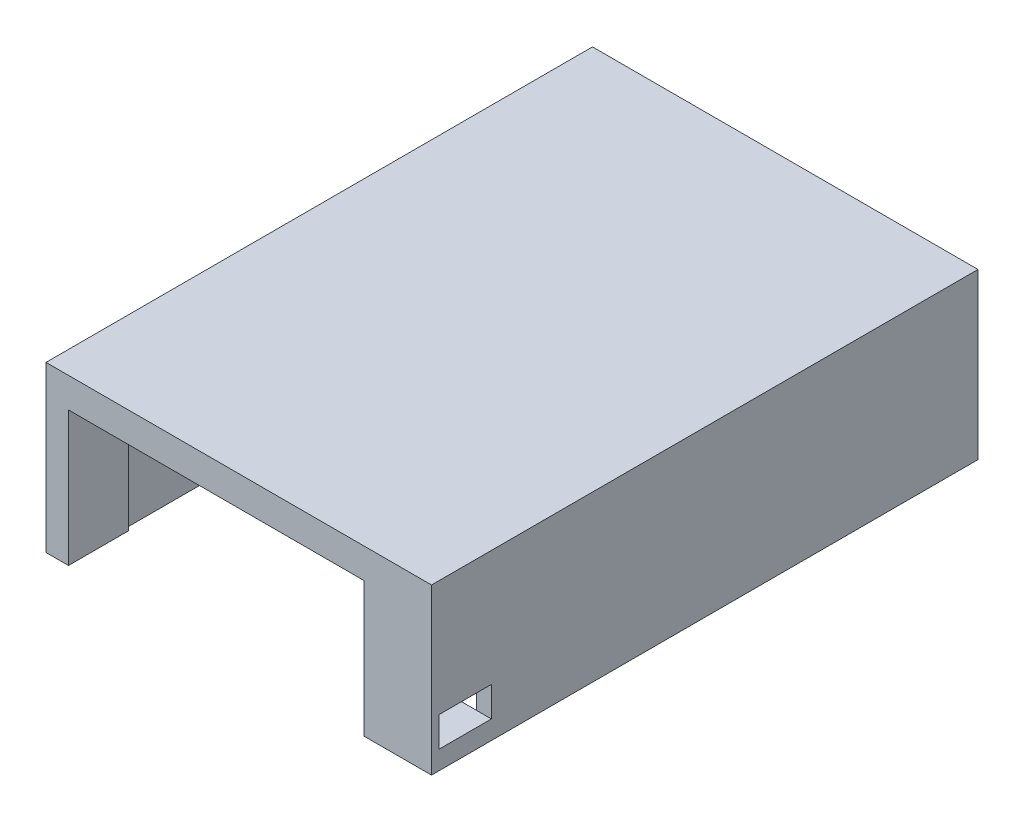
ISO-10303-21;
HEADER;
FILE_DESCRIPTION(('STEP AP214'),'2;1');
FILE_NAME('part.step','',(''),(''),'','','');
FILE_SCHEMA(('AUTOMOTIVE_DESIGN { 1 0 10303 214 1 1 1 1 }'));
ENDSEC;
DATA;
#1=APPLICATION_CONTEXT('core data for automotive mechanical design processes');
#2=APPLICATION_PROTOCOL_DEFINITION('international standard','automotive_design',2000,#1);
#3=PRODUCT_CONTEXT('',#1,'mechanical');
#4=PRODUCT('Part','Part','',(#3));
#5=PRODUCT_RELATED_PRODUCT_CATEGORY('part','',(#4));
#6=PRODUCT_DEFINITION_FORMATION('','',#4);
#7=PRODUCT_DEFINITION_CONTEXT('part definition',#1,'design');
#8=PRODUCT_DEFINITION('design','',#6,#7);
#9=PRODUCT_DEFINITION_SHAPE('','',#8);
#10=(LENGTH_UNIT() NAMED_UNIT(*) SI_UNIT(.MILLI.,.METRE.));
#11=(NAMED_UNIT(*) PLANE_ANGLE_UNIT() SI_UNIT($,.RADIAN.));
#12=(NAMED_UNIT(*) SI_UNIT($,.STERADIAN.) SOLID_ANGLE_UNIT());
#13=UNCERTAINTY_MEASURE_WITH_UNIT(LENGTH_MEASURE(1.E-05),#10,'distance_accuracy_value','');
#14=(GEOMETRIC_REPRESENTATION_CONTEXT(3) GLOBAL_UNCERTAINTY_ASSIGNED_CONTEXT((#13)) GLOBAL_UNIT_ASSIGNED_CONTEXT((#10,
#11,#12)) REPRESENTATION_CONTEXT('',''));
#15=CARTESIAN_POINT('',(0.,0.,0.));
#16=DIRECTION('',(0.,0.,1.));
#17=DIRECTION('',(1.,0.,0.));
#18=AXIS2_PLACEMENT_3D('',#15,#16,#17);
#19=CARTESIAN_POINT('',(-61.3744815271287,22.,35.6818761790594));
#20=DIRECTION('',(0.,0.,-1.));
#21=DIRECTION('',(-1.,0.,0.));
#22=AXIS2_PLACEMENT_3D('',#19,#20,#21);
#23=PLANE('',#22);
#24=DIRECTION('',(0.,-1.,0.));
#25=VECTOR('',#24,1.);
#26=CARTESIAN_POINT('',(-58.3744815271287,18.,35.6818761790594));
#27=LINE('',#26,#25);
#28=CARTESIAN_POINT('',(-58.3744815271287,18.,35.6818761790594));
#29=VERTEX_POINT('',#28);
#30=CARTESIAN_POINT('',(-58.3744815271287,0.,35.6818761790594));
#31=VERTEX_POINT('',#30);
#32=EDGE_CURVE('E355',#29,#31,#27,.T.);
#33=ORIENTED_EDGE('',*,*,#32,.F.);
#34=DIRECTION('',(-1.,0.,0.));
#35=VECTOR('',#34,1.);
#36=CARTESIAN_POINT('',(0.,18.,35.6818761790594));
#37=LINE('',#36,#35);
#38=CARTESIAN_POINT('',(-18.8744815271287,18.,35.6818761790594));
#39=VERTEX_POINT('',#38);
#40=EDGE_CURVE('E323',#39,#29,#37,.T.);
#41=ORIENTED_EDGE('',*,*,#40,.F.);
#42=DIRECTION('',(0.,-1.,0.));
#43=VECTOR('',#42,1.);
#44=CARTESIAN_POINT('',(-18.8744815271287,18.,35.6818761790594));
#45=LINE('',#44,#43);
#46=CARTESIAN_POINT('',(-18.8744815271287,0.,35.6818761790594));
#47=VERTEX_POINT('',#46);
#48=EDGE_CURVE('E358',#39,#47,#45,.T.);
#49=ORIENTED_EDGE('',*,*,#48,.T.);
#50=DIRECTION('',(1.,0.,0.));
#51=VECTOR('',#50,1.);
#52=CARTESIAN_POINT('',(-61.3744815271287,0.,35.6818761790594));
#53=LINE('',#52,#51);
#54=CARTESIAN_POINT('',(-9.87448152712869,0.,35.6818761790594));
#55=VERTEX_POINT('',#54);
#56=EDGE_CURVE('E403',#47,#55,#53,.T.);
#57=ORIENTED_EDGE('',*,*,#56,.T.);
#58=DIRECTION('',(0.,-1.,0.));
#59=VECTOR('',#58,1.);
#60=CARTESIAN_POINT('',(-9.87448152712869,22.,35.6818761790594));
#61=LINE('',#60,#59);
#62=CARTESIAN_POINT('',(-9.87448152712869,22.,35.6818761790594));
#63=VERTEX_POINT('',#62);
#64=EDGE_CURVE('E42',#63,#55,#61,.T.);
#65=ORIENTED_EDGE('',*,*,#64,.F.);
#66=DIRECTION('',(1.,0.,0.));
#67=VECTOR('',#66,1.);
#68=CARTESIAN_POINT('',(-61.3744815271287,22.,35.6818761790594));
#69=LINE('',#68,#67);
#70=CARTESIAN_POINT('',(-61.3744815271287,22.,35.6818761790594));
#71=VERTEX_POINT('',#70);
#72=EDGE_CURVE('E391',#71,#63,#69,.T.);
#73=ORIENTED_EDGE('',*,*,#72,.F.);
#74=DIRECTION('',(0.,-1.,0.));
#75=VECTOR('',#74,1.);
#76=CARTESIAN_POINT('',(-61.3744815271287,22.,35.6818761790594));
#77=LINE('',#76,#75);
#78=CARTESIAN_POINT('',(-61.3744815271287,0.,35.6818761790594));
#79=VERTEX_POINT('',#78);
#80=EDGE_CURVE('E11',#71,#79,#77,.T.);
#81=ORIENTED_EDGE('',*,*,#80,.T.);
#82=EDGE_CURVE('E404',#79,#31,#53,.T.);
#83=ORIENTED_EDGE('',*,*,#82,.T.);
#84=EDGE_LOOP('',(#33,#41,#49,#57,#65,#73,#81,#83));
#85=FACE_BOUND('',#84,.T.);
#86=ADVANCED_FACE('F33',(#85),#23,.F.);
#87=CARTESIAN_POINT('',(-61.3744815271287,22.,-37.3181238209406));
#88=DIRECTION('',(0.,0.,-1.));
#89=DIRECTION('',(-1.,0.,0.));
#90=AXIS2_PLACEMENT_3D('',#87,#88,#89);
#91=PLANE('',#90);
#92=DIRECTION('',(1.,0.,0.));
#93=VECTOR('',#92,1.);
#94=CARTESIAN_POINT('',(-61.3744815271287,0.,-37.3181238209406));
#95=LINE('',#94,#93);
#96=CARTESIAN_POINT('',(-12.8744815271287,0.,-37.3181238209406));
#97=VERTEX_POINT('',#96);
#98=CARTESIAN_POINT('',(-9.8744815271287,0.,-37.3181238209406));
#99=VERTEX_POINT('',#98);
#100=EDGE_CURVE('E410',#97,#99,#95,.T.);
#101=ORIENTED_EDGE('',*,*,#100,.F.);
#102=DIRECTION('',(0.,-1.,0.));
#103=VECTOR('',#102,1.);
#104=CARTESIAN_POINT('',(-12.8744815271287,18.,-37.3181238209406));
#105=LINE('',#104,#103);
#106=CARTESIAN_POINT('',(-12.8744815271287,18.,-37.3181238209406));
#107=VERTEX_POINT('',#106);
#108=EDGE_CURVE('E372',#107,#97,#105,.T.);
#109=ORIENTED_EDGE('',*,*,#108,.F.);
#110=DIRECTION('',(1.,0.,0.));
#111=VECTOR('',#110,1.);
#112=CARTESIAN_POINT('',(0.,18.,-37.3181238209406));
#113=LINE('',#112,#111);
#114=CARTESIAN_POINT('',(-52.3744815271287,18.,-37.3181238209406));
#115=VERTEX_POINT('',#114);
#116=EDGE_CURVE('E310',#115,#107,#113,.T.);
#117=ORIENTED_EDGE('',*,*,#116,.F.);
#118=DIRECTION('',(0.,-1.,0.));
#119=VECTOR('',#118,1.);
#120=CARTESIAN_POINT('',(-52.3744815271287,18.,-37.3181238209406));
#121=LINE('',#120,#119);
#122=CARTESIAN_POINT('',(-52.3744815271287,0.,-37.3181238209406));
#123=VERTEX_POINT('',#122);
#124=EDGE_CURVE('E374',#115,#123,#121,.T.);
#125=ORIENTED_EDGE('',*,*,#124,.T.);
#126=CARTESIAN_POINT('',(-61.3744815271287,0.,-37.3181238209406));
#127=VERTEX_POINT('',#126);
#128=EDGE_CURVE('E392',#127,#123,#95,.T.);
#129=ORIENTED_EDGE('',*,*,#128,.F.);
#130=DIRECTION('',(0.,-1.,0.));
#131=VECTOR('',#130,1.);
#132=CARTESIAN_POINT('',(-61.3744815271287,22.,-37.3181238209406));
#133=LINE('',#132,#131);
#134=CARTESIAN_POINT('',(-61.3744815271287,22.,-37.3181238209406));
#135=VERTEX_POINT('',#134);
#136=EDGE_CURVE('E400',#135,#127,#133,.T.);
#137=ORIENTED_EDGE('',*,*,#136,.F.);
#138=DIRECTION('',(1.,0.,0.));
#139=VECTOR('',#138,1.);
#140=CARTESIAN_POINT('',(-61.3744815271287,22.,-37.3181238209406));
#141=LINE('',#140,#139);
#142=CARTESIAN_POINT('',(-9.8744815271287,22.,-37.3181238209406));
#143=VERTEX_POINT('',#142);
#144=EDGE_CURVE('E397',#135,#143,#141,.T.);
#145=ORIENTED_EDGE('',*,*,#144,.T.);
#146=DIRECTION('',(0.,-1.,0.));
#147=VECTOR('',#146,1.);
#148=CARTESIAN_POINT('',(-9.8744815271287,22.,-37.3181238209406));
#149=LINE('',#148,#147);
#150=EDGE_CURVE('E414',#143,#99,#149,.T.);
#151=ORIENTED_EDGE('',*,*,#150,.T.);
#152=EDGE_LOOP('',(#101,#109,#117,#125,#129,#137,#145,#151));
#153=FACE_BOUND('',#152,.T.);
#154=ADVANCED_FACE('F447',(#153),#91,.T.);
#155=CARTESIAN_POINT('',(0.,0.,0.));
#156=DIRECTION('',(0.,1.,0.));
#157=DIRECTION('',(0.,0.,1.));
#158=AXIS2_PLACEMENT_3D('',#155,#156,#157);
#159=PLANE('',#158);
#160=CARTESIAN_POINT('',(-15.8744815271287,0.,31.6818761790594));
#161=DIRECTION('',(0.,-1.,0.));
#162=DIRECTION('',(0.,0.,-1.));
#163=AXIS2_PLACEMENT_3D('',#160,#161,#162);
#164=CIRCLE('',#163,2.);
#165=CARTESIAN_POINT('',(-15.8744815271287,0.,29.6818761790594));
#166=VERTEX_POINT('',#165);
#167=EDGE_CURVE('E288',#166,#166,#164,.T.);
#168=ORIENTED_EDGE('',*,*,#167,.F.);
#169=EDGE_LOOP('',(#168));
#170=FACE_BOUND('',#169,.T.);
#171=DIRECTION('',(0.,0.,-1.));
#172=VECTOR('',#171,1.);
#173=CARTESIAN_POINT('',(-18.8744815271287,0.,0.));
#174=LINE('',#173,#172);
#175=CARTESIAN_POINT('',(-18.8744815271287,0.,27.6818761790594));
#176=VERTEX_POINT('',#175);
#177=EDGE_CURVE('E302',#47,#176,#174,.T.);
#178=ORIENTED_EDGE('',*,*,#177,.T.);
#179=DIRECTION('',(1.,0.,0.));
#180=VECTOR('',#179,1.);
#181=CARTESIAN_POINT('',(0.,0.,27.6818761790594));
#182=LINE('',#181,#180);
#183=CARTESIAN_POINT('',(-11.8758749410098,0.,27.6818761790594));
#184=VERTEX_POINT('',#183);
#185=EDGE_CURVE('E350',#176,#184,#182,.T.);
#186=ORIENTED_EDGE('',*,*,#185,.T.);
#187=DIRECTION('',(0.,0.,-1.));
#188=VECTOR('',#187,1.);
#189=CARTESIAN_POINT('',(-11.8758749410098,0.,0.));
#190=LINE('',#189,#188);
#191=CARTESIAN_POINT('',(-11.8758749410098,0.,-29.3181238209406));
#192=VERTEX_POINT('',#191);
#193=EDGE_CURVE('E347',#184,#192,#190,.T.);
#194=ORIENTED_EDGE('',*,*,#193,.T.);
#195=DIRECTION('',(-1.,0.,0.));
#196=VECTOR('',#195,1.);
#197=CARTESIAN_POINT('',(0.,0.,-29.3181238209406));
#198=LINE('',#197,#196);
#199=CARTESIAN_POINT('',(-12.8744815271287,0.,-29.3181238209406));
#200=VERTEX_POINT('',#199);
#201=EDGE_CURVE('E344',#192,#200,#198,.T.);
#202=ORIENTED_EDGE('',*,*,#201,.T.);
#203=DIRECTION('',(0.,0.,-1.));
#204=VECTOR('',#203,1.);
#205=CARTESIAN_POINT('',(-12.8744815271287,0.,0.));
#206=LINE('',#205,#204);
#207=EDGE_CURVE('E341',#200,#97,#206,.T.);
#208=ORIENTED_EDGE('',*,*,#207,.T.);
#209=ORIENTED_EDGE('',*,*,#100,.T.);
#210=DIRECTION('',(0.,0.,1.));
#211=VECTOR('',#210,1.);
#212=CARTESIAN_POINT('',(-9.8744815271287,0.,-37.3181238209406));
#213=LINE('',#212,#211);
#214=EDGE_CURVE('E407',#99,#55,#213,.T.);
#215=ORIENTED_EDGE('',*,*,#214,.T.);
#216=ORIENTED_EDGE('',*,*,#56,.F.);
#217=EDGE_LOOP('',(#178,#186,#194,#202,#208,#209,#215,#216));
#218=FACE_BOUND('',#217,.T.);
#219=ADVANCED_FACE('F452',(#170,#218),#159,.F.);
#220=CARTESIAN_POINT('',(-55.3744815271287,0.,-33.3181238209406));
#221=DIRECTION('',(0.,-1.,0.));
#222=DIRECTION('',(0.,0.,-1.));
#223=AXIS2_PLACEMENT_3D('',#220,#221,#222);
#224=CIRCLE('',#223,2.);
#225=CARTESIAN_POINT('',(-55.3744815271287,0.,-35.3181238209406));
#226=VERTEX_POINT('',#225);
#227=EDGE_CURVE('E289',#226,#226,#224,.T.);
#228=ORIENTED_EDGE('',*,*,#227,.F.);
#229=EDGE_LOOP('',(#228));
#230=FACE_BOUND('',#229,.T.);
#231=DIRECTION('',(0.,0.,1.));
#232=VECTOR('',#231,1.);
#233=CARTESIAN_POINT('',(-58.3744815271287,0.,0.));
#234=LINE('',#233,#232);
#235=CARTESIAN_POINT('',(-58.3744815271287,0.,27.6818761790594));
#236=VERTEX_POINT('',#235);
#237=EDGE_CURVE('E296',#236,#31,#234,.T.);
#238=ORIENTED_EDGE('',*,*,#237,.T.);
#239=ORIENTED_EDGE('',*,*,#82,.F.);
#240=DIRECTION('',(0.,0.,1.));
#241=VECTOR('',#240,1.);
#242=CARTESIAN_POINT('',(-61.3744815271287,0.,-37.3181238209406));
#243=LINE('',#242,#241);
#244=EDGE_CURVE('E357',#127,#79,#243,.T.);
#245=ORIENTED_EDGE('',*,*,#244,.F.);
#246=ORIENTED_EDGE('',*,*,#128,.T.);
#247=DIRECTION('',(0.,0.,1.));
#248=VECTOR('',#247,1.);
#249=CARTESIAN_POINT('',(-52.3744815271287,0.,0.));
#250=LINE('',#249,#248);
#251=CARTESIAN_POINT('',(-52.3744815271287,0.,-29.3181238209406));
#252=VERTEX_POINT('',#251);
#253=EDGE_CURVE('E338',#123,#252,#250,.T.);
#254=ORIENTED_EDGE('',*,*,#253,.T.);
#255=DIRECTION('',(-1.,0.,0.));
#256=VECTOR('',#255,1.);
#257=CARTESIAN_POINT('',(0.,0.,-29.3181238209406));
#258=LINE('',#257,#256);
#259=CARTESIAN_POINT('',(-58.8744815271287,0.,-29.3181238209406));
#260=VERTEX_POINT('',#259);
#261=EDGE_CURVE('E335',#252,#260,#258,.T.);
#262=ORIENTED_EDGE('',*,*,#261,.T.);
#263=DIRECTION('',(0.,0.,1.));
#264=VECTOR('',#263,1.);
#265=CARTESIAN_POINT('',(-58.8744815271287,0.,0.));
#266=LINE('',#265,#264);
#267=CARTESIAN_POINT('',(-58.8744815271287,0.,27.6818761790594));
#268=VERTEX_POINT('',#267);
#269=EDGE_CURVE('E332',#260,#268,#266,.T.);
#270=ORIENTED_EDGE('',*,*,#269,.T.);
#271=DIRECTION('',(1.,0.,0.));
#272=VECTOR('',#271,1.);
#273=CARTESIAN_POINT('',(0.,0.,27.6818761790594));
#274=LINE('',#273,#272);
#275=EDGE_CURVE('E329',#268,#236,#274,.T.);
#276=ORIENTED_EDGE('',*,*,#275,.T.);
#277=EDGE_LOOP('',(#238,#239,#245,#246,#254,#262,#270,#276));
#278=FACE_BOUND('',#277,.T.);
#279=ADVANCED_FACE('F464',(#230,#278),#159,.F.);
#280=CARTESIAN_POINT('',(-61.3744815271287,22.,-37.3181238209406));
#281=DIRECTION('',(1.,0.,0.));
#282=DIRECTION('',(0.,0.,-1.));
#283=AXIS2_PLACEMENT_3D('',#280,#281,#282);
#284=PLANE('',#283);
#285=DIRECTION('',(0.,0.,1.));
#286=VECTOR('',#285,1.);
#287=CARTESIAN_POINT('',(-61.3744815271287,2.5,-36.3181238209406));
#288=LINE('',#287,#286);
#289=CARTESIAN_POINT('',(-61.3744815271287,2.5,-36.3181238209406));
#290=VERTEX_POINT('',#289);
#291=CARTESIAN_POINT('',(-61.3744815271287,2.5,-29.3181238209406));
#292=VERTEX_POINT('',#291);
#293=EDGE_CURVE('E265',#290,#292,#288,.T.);
#294=ORIENTED_EDGE('',*,*,#293,.F.);
#295=DIRECTION('',(0.,-1.,0.));
#296=VECTOR('',#295,1.);
#297=CARTESIAN_POINT('',(-61.3744815271287,6.5,-36.3181238209406));
#298=LINE('',#297,#296);
#299=CARTESIAN_POINT('',(-61.3744815271287,6.5,-36.3181238209406));
#300=VERTEX_POINT('',#299);
#301=EDGE_CURVE('E263',#300,#290,#298,.T.);
#302=ORIENTED_EDGE('',*,*,#301,.F.);
#303=DIRECTION('',(0.,0.,-1.));
#304=VECTOR('',#303,1.);
#305=CARTESIAN_POINT('',(-61.3744815271287,6.5,-36.3181238209406));
#306=LINE('',#305,#304);
#307=CARTESIAN_POINT('',(-61.3744815271287,6.5,-29.3181238209406));
#308=VERTEX_POINT('',#307);
#309=EDGE_CURVE('E254',#308,#300,#306,.T.);
#310=ORIENTED_EDGE('',*,*,#309,.F.);
#311=DIRECTION('',(0.,1.,0.));
#312=VECTOR('',#311,1.);
#313=CARTESIAN_POINT('',(-61.3744815271287,6.5,-29.3181238209406));
#314=LINE('',#313,#312);
#315=EDGE_CURVE('E268',#292,#308,#314,.T.);
#316=ORIENTED_EDGE('',*,*,#315,.F.);
#317=EDGE_LOOP('',(#294,#302,#310,#316));
#318=FACE_BOUND('',#317,.T.);
#319=ORIENTED_EDGE('',*,*,#244,.T.);
#320=ORIENTED_EDGE('',*,*,#80,.F.);
#321=DIRECTION('',(0.,0.,1.));
#322=VECTOR('',#321,1.);
#323=CARTESIAN_POINT('',(-61.3744815271287,22.,-37.3181238209406));
#324=LINE('',#323,#322);
#325=EDGE_CURVE('E388',#135,#71,#324,.T.);
#326=ORIENTED_EDGE('',*,*,#325,.F.);
#327=ORIENTED_EDGE('',*,*,#136,.T.);
#328=EDGE_LOOP('',(#319,#320,#326,#327));
#329=FACE_BOUND('',#328,.T.);
#330=ADVANCED_FACE('F35',(#318,#329),#284,.F.);
#331=CARTESIAN_POINT('',(-9.8744815271287,22.,-37.3181238209406));
#332=DIRECTION('',(1.,0.,0.));
#333=DIRECTION('',(0.,0.,-1.));
#334=AXIS2_PLACEMENT_3D('',#331,#332,#333);
#335=PLANE('',#334);
#336=DIRECTION('',(0.,-1.,0.));
#337=VECTOR('',#336,1.);
#338=CARTESIAN_POINT('',(-9.87448152712869,6.5,34.6818761790594));
#339=LINE('',#338,#337);
#340=CARTESIAN_POINT('',(-9.87448152712869,6.5,34.6818761790594));
#341=VERTEX_POINT('',#340);
#342=CARTESIAN_POINT('',(-9.87448152712869,2.5,34.6818761790594));
#343=VERTEX_POINT('',#342);
#344=EDGE_CURVE('E50',#341,#343,#339,.T.);
#345=ORIENTED_EDGE('',*,*,#344,.F.);
#346=DIRECTION('',(0.,0.,1.));
#347=VECTOR('',#346,1.);
#348=CARTESIAN_POINT('',(-9.87448152712869,6.5,34.6818761790594));
#349=LINE('',#348,#347);
#350=CARTESIAN_POINT('',(-9.87448152712869,6.5,27.6818761790594));
#351=VERTEX_POINT('',#350);
#352=EDGE_CURVE('E231',#351,#341,#349,.T.);
#353=ORIENTED_EDGE('',*,*,#352,.F.);
#354=DIRECTION('',(0.,1.,0.));
#355=VECTOR('',#354,1.);
#356=CARTESIAN_POINT('',(-9.87448152712869,6.5,27.6818761790594));
#357=LINE('',#356,#355);
#358=CARTESIAN_POINT('',(-9.87448152712869,2.5,27.6818761790594));
#359=VERTEX_POINT('',#358);
#360=EDGE_CURVE('E234',#359,#351,#357,.T.);
#361=ORIENTED_EDGE('',*,*,#360,.F.);
#362=DIRECTION('',(0.,0.,-1.));
#363=VECTOR('',#362,1.);
#364=CARTESIAN_POINT('',(-9.87448152712869,2.5,34.6818761790594));
#365=LINE('',#364,#363);
#366=EDGE_CURVE('E240',#343,#359,#365,.T.);
#367=ORIENTED_EDGE('',*,*,#366,.F.);
#368=EDGE_LOOP('',(#345,#353,#361,#367));
#369=FACE_BOUND('',#368,.T.);
#370=ORIENTED_EDGE('',*,*,#214,.F.);
#371=ORIENTED_EDGE('',*,*,#150,.F.);
#372=DIRECTION('',(0.,0.,1.));
#373=VECTOR('',#372,1.);
#374=CARTESIAN_POINT('',(-9.8744815271287,22.,-37.3181238209406));
#375=LINE('',#374,#373);
#376=EDGE_CURVE('E394',#143,#63,#375,.T.);
#377=ORIENTED_EDGE('',*,*,#376,.T.);
#378=ORIENTED_EDGE('',*,*,#64,.T.);
#379=EDGE_LOOP('',(#370,#371,#377,#378));
#380=FACE_BOUND('',#379,.T.);
#381=ADVANCED_FACE('F457',(#369,#380),#335,.T.);
#382=CARTESIAN_POINT('',(0.,22.,0.));
#383=DIRECTION('',(0.,1.,0.));
#384=DIRECTION('',(0.,0.,1.));
#385=AXIS2_PLACEMENT_3D('',#382,#383,#384);
#386=PLANE('',#385);
#387=ORIENTED_EDGE('',*,*,#325,.T.);
#388=ORIENTED_EDGE('',*,*,#72,.T.);
#389=ORIENTED_EDGE('',*,*,#376,.F.);
#390=ORIENTED_EDGE('',*,*,#144,.F.);
#391=EDGE_LOOP('',(#387,#388,#389,#390));
#392=FACE_BOUND('',#391,.T.);
#393=ADVANCED_FACE('F459',(#392),#386,.T.);
#394=CARTESIAN_POINT('',(-58.3744815271287,18.,0.));
#395=DIRECTION('',(1.,0.,0.));
#396=DIRECTION('',(0.,0.,-1.));
#397=AXIS2_PLACEMENT_3D('',#394,#395,#396);
#398=PLANE('',#397);
#399=ORIENTED_EDGE('',*,*,#237,.F.);
#400=DIRECTION('',(0.,-1.,0.));
#401=VECTOR('',#400,1.);
#402=CARTESIAN_POINT('',(-58.3744815271287,18.,27.6818761790594));
#403=LINE('',#402,#401);
#404=CARTESIAN_POINT('',(-58.3744815271287,18.,27.6818761790594));
#405=VERTEX_POINT('',#404);
#406=EDGE_CURVE('E326',#405,#236,#403,.T.);
#407=ORIENTED_EDGE('',*,*,#406,.F.);
#408=DIRECTION('',(0.,0.,1.));
#409=VECTOR('',#408,1.);
#410=CARTESIAN_POINT('',(-58.3744815271287,18.,0.));
#411=LINE('',#410,#409);
#412=EDGE_CURVE('E299',#405,#29,#411,.T.);
#413=ORIENTED_EDGE('',*,*,#412,.T.);
#414=ORIENTED_EDGE('',*,*,#32,.T.);
#415=EDGE_LOOP('',(#399,#407,#413,#414));
#416=FACE_BOUND('',#415,.T.);
#417=ADVANCED_FACE('F468',(#416),#398,.T.);
#418=CARTESIAN_POINT('',(-18.8744815271287,18.,0.));
#419=DIRECTION('',(-1.,0.,0.));
#420=DIRECTION('',(0.,0.,1.));
#421=AXIS2_PLACEMENT_3D('',#418,#419,#420);
#422=PLANE('',#421);
#423=ORIENTED_EDGE('',*,*,#177,.F.);
#424=ORIENTED_EDGE('',*,*,#48,.F.);
#425=DIRECTION('',(0.,0.,-1.));
#426=VECTOR('',#425,1.);
#427=CARTESIAN_POINT('',(-18.8744815271287,18.,0.));
#428=LINE('',#427,#426);
#429=CARTESIAN_POINT('',(-18.8744815271287,18.,27.6818761790594));
#430=VERTEX_POINT('',#429);
#431=EDGE_CURVE('E321',#39,#430,#428,.T.);
#432=ORIENTED_EDGE('',*,*,#431,.T.);
#433=DIRECTION('',(0.,-1.,0.));
#434=VECTOR('',#433,1.);
#435=CARTESIAN_POINT('',(-18.8744815271287,18.,27.6818761790594));
#436=LINE('',#435,#434);
#437=EDGE_CURVE('E361',#430,#176,#436,.T.);
#438=ORIENTED_EDGE('',*,*,#437,.T.);
#439=EDGE_LOOP('',(#423,#424,#432,#438));
#440=FACE_BOUND('',#439,.T.);
#441=ADVANCED_FACE('F472',(#440),#422,.T.);
#442=CARTESIAN_POINT('',(0.,18.,27.6818761790594));
#443=DIRECTION('',(0.,0.,-1.));
#444=DIRECTION('',(-1.,0.,0.));
#445=AXIS2_PLACEMENT_3D('',#442,#443,#444);
#446=PLANE('',#445);
#447=DIRECTION('',(1.,0.,0.));
#448=VECTOR('',#447,1.);
#449=CARTESIAN_POINT('',(-18.3744815271287,6.5,27.6818761790594));
#450=LINE('',#449,#448);
#451=CARTESIAN_POINT('',(-18.3744815271287,6.5,27.6818761790594));
#452=VERTEX_POINT('',#451);
#453=CARTESIAN_POINT('',(-11.8758749410098,6.5,27.6818761790594));
#454=VERTEX_POINT('',#453);
#455=EDGE_CURVE('E58',#452,#454,#450,.T.);
#456=ORIENTED_EDGE('',*,*,#455,.F.);
#457=DIRECTION('',(0.,1.,0.));
#458=VECTOR('',#457,1.);
#459=CARTESIAN_POINT('',(-18.3744815271287,6.5,27.6818761790594));
#460=LINE('',#459,#458);
#461=CARTESIAN_POINT('',(-18.3744815271287,2.5,27.6818761790594));
#462=VERTEX_POINT('',#461);
#463=EDGE_CURVE('E228',#462,#452,#460,.T.);
#464=ORIENTED_EDGE('',*,*,#463,.F.);
#465=DIRECTION('',(1.,0.,0.));
#466=VECTOR('',#465,1.);
#467=CARTESIAN_POINT('',(-18.3744815271287,2.5,27.6818761790594));
#468=LINE('',#467,#466);
#469=CARTESIAN_POINT('',(-11.8758749410098,2.5,27.6818761790594));
#470=VERTEX_POINT('',#469);
#471=EDGE_CURVE('E225',#462,#470,#468,.T.);
#472=ORIENTED_EDGE('',*,*,#471,.T.);
#473=DIRECTION('',(0.,-1.,0.));
#474=VECTOR('',#473,1.);
#475=CARTESIAN_POINT('',(-11.8758749410098,18.,27.6818761790594));
#476=LINE('',#475,#474);
#477=EDGE_CURVE('E367',#470,#184,#476,.T.);
#478=ORIENTED_EDGE('',*,*,#477,.T.);
#479=ORIENTED_EDGE('',*,*,#185,.F.);
#480=ORIENTED_EDGE('',*,*,#437,.F.);
#481=DIRECTION('',(1.,0.,0.));
#482=VECTOR('',#481,1.);
#483=CARTESIAN_POINT('',(0.,18.,27.6818761790594));
#484=LINE('',#483,#482);
#485=CARTESIAN_POINT('',(-11.8758749410098,18.,27.6818761790594));
#486=VERTEX_POINT('',#485);
#487=EDGE_CURVE('E319',#430,#486,#484,.T.);
#488=ORIENTED_EDGE('',*,*,#487,.T.);
#489=EDGE_CURVE('E363',#486,#454,#476,.T.);
#490=ORIENTED_EDGE('',*,*,#489,.T.);
#491=EDGE_LOOP('',(#456,#464,#472,#478,#479,#480,#488,#490));
#492=FACE_BOUND('',#491,.T.);
#493=ADVANCED_FACE('F502',(#492),#446,.T.);
#494=CARTESIAN_POINT('',(-11.8758749410098,18.,0.));
#495=DIRECTION('',(-1.,0.,0.));
#496=DIRECTION('',(0.,0.,1.));
#497=AXIS2_PLACEMENT_3D('',#494,#495,#496);
#498=PLANE('',#497);
#499=ORIENTED_EDGE('',*,*,#193,.F.);
#500=ORIENTED_EDGE('',*,*,#477,.F.);
#501=EDGE_CURVE('E366',#454,#470,#476,.T.);
#502=ORIENTED_EDGE('',*,*,#501,.F.);
#503=ORIENTED_EDGE('',*,*,#489,.F.);
#504=DIRECTION('',(0.,0.,-1.));
#505=VECTOR('',#504,1.);
#506=CARTESIAN_POINT('',(-11.8758749410098,18.,0.));
#507=LINE('',#506,#505);
#508=CARTESIAN_POINT('',(-11.8758749410098,18.,-29.3181238209406));
#509=VERTEX_POINT('',#508);
#510=EDGE_CURVE('E317',#486,#509,#507,.T.);
#511=ORIENTED_EDGE('',*,*,#510,.T.);
#512=DIRECTION('',(0.,-1.,0.));
#513=VECTOR('',#512,1.);
#514=CARTESIAN_POINT('',(-11.8758749410098,18.,-29.3181238209406));
#515=LINE('',#514,#513);
#516=EDGE_CURVE('E368',#509,#192,#515,.T.);
#517=ORIENTED_EDGE('',*,*,#516,.T.);
#518=EDGE_LOOP('',(#499,#500,#502,#503,#511,#517));
#519=FACE_BOUND('',#518,.T.);
#520=ADVANCED_FACE('F498',(#519),#498,.T.);
#521=CARTESIAN_POINT('',(0.,18.,-29.3181238209406));
#522=DIRECTION('',(0.,0.,1.));
#523=DIRECTION('',(1.,0.,0.));
#524=AXIS2_PLACEMENT_3D('',#521,#522,#523);
#525=PLANE('',#524);
#526=ORIENTED_EDGE('',*,*,#201,.F.);
#527=ORIENTED_EDGE('',*,*,#516,.F.);
#528=DIRECTION('',(-1.,0.,0.));
#529=VECTOR('',#528,1.);
#530=CARTESIAN_POINT('',(0.,18.,-29.3181238209406));
#531=LINE('',#530,#529);
#532=CARTESIAN_POINT('',(-12.8744815271287,18.,-29.3181238209406));
#533=VERTEX_POINT('',#532);
#534=EDGE_CURVE('E315',#509,#533,#531,.T.);
#535=ORIENTED_EDGE('',*,*,#534,.T.);
#536=DIRECTION('',(0.,-1.,0.));
#537=VECTOR('',#536,1.);
#538=CARTESIAN_POINT('',(-12.8744815271287,18.,-29.3181238209406));
#539=LINE('',#538,#537);
#540=EDGE_CURVE('E370',#533,#200,#539,.T.);
#541=ORIENTED_EDGE('',*,*,#540,.T.);
#542=EDGE_LOOP('',(#526,#527,#535,#541));
#543=FACE_BOUND('',#542,.T.);
#544=ADVANCED_FACE('F494',(#543),#525,.T.);
#545=CARTESIAN_POINT('',(-12.8744815271287,18.,0.));
#546=DIRECTION('',(-1.,0.,0.));
#547=DIRECTION('',(0.,0.,1.));
#548=AXIS2_PLACEMENT_3D('',#545,#546,#547);
#549=PLANE('',#548);
#550=ORIENTED_EDGE('',*,*,#207,.F.);
#551=ORIENTED_EDGE('',*,*,#540,.F.);
#552=DIRECTION('',(0.,0.,-1.));
#553=VECTOR('',#552,1.);
#554=CARTESIAN_POINT('',(-12.8744815271287,18.,0.));
#555=LINE('',#554,#553);
#556=EDGE_CURVE('E313',#533,#107,#555,.T.);
#557=ORIENTED_EDGE('',*,*,#556,.T.);
#558=ORIENTED_EDGE('',*,*,#108,.T.);
#559=EDGE_LOOP('',(#550,#551,#557,#558));
#560=FACE_BOUND('',#559,.T.);
#561=ADVANCED_FACE('F490',(#560),#549,.T.);
#562=CARTESIAN_POINT('',(-52.3744815271287,18.,0.));
#563=DIRECTION('',(1.,0.,0.));
#564=DIRECTION('',(0.,0.,-1.));
#565=AXIS2_PLACEMENT_3D('',#562,#563,#564);
#566=PLANE('',#565);
#567=ORIENTED_EDGE('',*,*,#253,.F.);
#568=ORIENTED_EDGE('',*,*,#124,.F.);
#569=DIRECTION('',(0.,0.,1.));
#570=VECTOR('',#569,1.);
#571=CARTESIAN_POINT('',(-52.3744815271287,18.,0.));
#572=LINE('',#571,#570);
#573=CARTESIAN_POINT('',(-52.3744815271287,18.,-29.3181238209406));
#574=VERTEX_POINT('',#573);
#575=EDGE_CURVE('E308',#115,#574,#572,.T.);
#576=ORIENTED_EDGE('',*,*,#575,.T.);
#577=DIRECTION('',(0.,-1.,0.));
#578=VECTOR('',#577,1.);
#579=CARTESIAN_POINT('',(-52.3744815271287,18.,-29.3181238209406));
#580=LINE('',#579,#578);
#581=EDGE_CURVE('E377',#574,#252,#580,.T.);
#582=ORIENTED_EDGE('',*,*,#581,.T.);
#583=EDGE_LOOP('',(#567,#568,#576,#582));
#584=FACE_BOUND('',#583,.T.);
#585=ADVANCED_FACE('F486',(#584),#566,.T.);
#586=CARTESIAN_POINT('',(0.,18.,-29.3181238209406));
#587=DIRECTION('',(0.,0.,1.));
#588=DIRECTION('',(1.,0.,0.));
#589=AXIS2_PLACEMENT_3D('',#586,#587,#588);
#590=PLANE('',#589);
#591=DIRECTION('',(-1.,0.,0.));
#592=VECTOR('',#591,1.);
#593=CARTESIAN_POINT('',(-52.8744815271287,6.5,-29.3181238209406));
#594=LINE('',#593,#592);
#595=CARTESIAN_POINT('',(-52.8744815271287,6.5,-29.3181238209406));
#596=VERTEX_POINT('',#595);
#597=CARTESIAN_POINT('',(-58.8744815271287,6.5,-29.3181238209406));
#598=VERTEX_POINT('',#597);
#599=EDGE_CURVE('E276',#596,#598,#594,.T.);
#600=ORIENTED_EDGE('',*,*,#599,.F.);
#601=DIRECTION('',(0.,1.,0.));
#602=VECTOR('',#601,1.);
#603=CARTESIAN_POINT('',(-52.8744815271287,6.5,-29.3181238209406));
#604=LINE('',#603,#602);
#605=CARTESIAN_POINT('',(-52.8744815271287,2.5,-29.3181238209406));
#606=VERTEX_POINT('',#605);
#607=EDGE_CURVE('E257',#606,#596,#604,.T.);
#608=ORIENTED_EDGE('',*,*,#607,.F.);
#609=DIRECTION('',(-1.,0.,0.));
#610=VECTOR('',#609,1.);
#611=CARTESIAN_POINT('',(-52.8744815271287,2.5,-29.3181238209406));
#612=LINE('',#611,#610);
#613=CARTESIAN_POINT('',(-58.8744815271287,2.5,-29.3181238209406));
#614=VERTEX_POINT('',#613);
#615=EDGE_CURVE('E279',#606,#614,#612,.T.);
#616=ORIENTED_EDGE('',*,*,#615,.T.);
#617=DIRECTION('',(0.,-1.,0.));
#618=VECTOR('',#617,1.);
#619=CARTESIAN_POINT('',(-58.8744815271287,18.,-29.3181238209406));
#620=LINE('',#619,#618);
#621=EDGE_CURVE('E383',#614,#260,#620,.T.);
#622=ORIENTED_EDGE('',*,*,#621,.T.);
#623=ORIENTED_EDGE('',*,*,#261,.F.);
#624=ORIENTED_EDGE('',*,*,#581,.F.);
#625=DIRECTION('',(-1.,0.,0.));
#626=VECTOR('',#625,1.);
#627=CARTESIAN_POINT('',(0.,18.,-29.3181238209406));
#628=LINE('',#627,#626);
#629=CARTESIAN_POINT('',(-58.8744815271287,18.,-29.3181238209406));
#630=VERTEX_POINT('',#629);
#631=EDGE_CURVE('E306',#574,#630,#628,.T.);
#632=ORIENTED_EDGE('',*,*,#631,.T.);
#633=EDGE_CURVE('E379',#630,#598,#620,.T.);
#634=ORIENTED_EDGE('',*,*,#633,.T.);
#635=EDGE_LOOP('',(#600,#608,#616,#622,#623,#624,#632,#634));
#636=FACE_BOUND('',#635,.T.);
#637=ADVANCED_FACE('F482',(#636),#590,.T.);
#638=CARTESIAN_POINT('',(-58.8744815271287,18.,0.));
#639=DIRECTION('',(1.,0.,0.));
#640=DIRECTION('',(0.,0.,-1.));
#641=AXIS2_PLACEMENT_3D('',#638,#639,#640);
#642=PLANE('',#641);
#643=ORIENTED_EDGE('',*,*,#269,.F.);
#644=ORIENTED_EDGE('',*,*,#621,.F.);
#645=EDGE_CURVE('E382',#598,#614,#620,.T.);
#646=ORIENTED_EDGE('',*,*,#645,.F.);
#647=ORIENTED_EDGE('',*,*,#633,.F.);
#648=DIRECTION('',(0.,0.,1.));
#649=VECTOR('',#648,1.);
#650=CARTESIAN_POINT('',(-58.8744815271287,18.,0.));
#651=LINE('',#650,#649);
#652=CARTESIAN_POINT('',(-58.8744815271287,18.,27.6818761790594));
#653=VERTEX_POINT('',#652);
#654=EDGE_CURVE('E304',#630,#653,#651,.T.);
#655=ORIENTED_EDGE('',*,*,#654,.T.);
#656=DIRECTION('',(0.,-1.,0.));
#657=VECTOR('',#656,1.);
#658=CARTESIAN_POINT('',(-58.8744815271287,18.,27.6818761790594));
#659=LINE('',#658,#657);
#660=EDGE_CURVE('E384',#653,#268,#659,.T.);
#661=ORIENTED_EDGE('',*,*,#660,.T.);
#662=EDGE_LOOP('',(#643,#644,#646,#647,#655,#661));
#663=FACE_BOUND('',#662,.T.);
#664=ADVANCED_FACE('F478',(#663),#642,.T.);
#665=CARTESIAN_POINT('',(0.,18.,27.6818761790594));
#666=DIRECTION('',(0.,0.,-1.));
#667=DIRECTION('',(-1.,0.,0.));
#668=AXIS2_PLACEMENT_3D('',#665,#666,#667);
#669=PLANE('',#668);
#670=ORIENTED_EDGE('',*,*,#275,.F.);
#671=ORIENTED_EDGE('',*,*,#660,.F.);
#672=DIRECTION('',(1.,0.,0.));
#673=VECTOR('',#672,1.);
#674=CARTESIAN_POINT('',(0.,18.,27.6818761790594));
#675=LINE('',#674,#673);
#676=EDGE_CURVE('E301',#653,#405,#675,.T.);
#677=ORIENTED_EDGE('',*,*,#676,.T.);
#678=ORIENTED_EDGE('',*,*,#406,.T.);
#679=EDGE_LOOP('',(#670,#671,#677,#678));
#680=FACE_BOUND('',#679,.T.);
#681=ADVANCED_FACE('F474',(#680),#669,.T.);
#682=CARTESIAN_POINT('',(0.,18.,0.));
#683=DIRECTION('',(0.,-1.,0.));
#684=DIRECTION('',(0.,0.,-1.));
#685=AXIS2_PLACEMENT_3D('',#682,#683,#684);
#686=PLANE('',#685);
#687=ORIENTED_EDGE('',*,*,#412,.F.);
#688=ORIENTED_EDGE('',*,*,#676,.F.);
#689=ORIENTED_EDGE('',*,*,#654,.F.);
#690=ORIENTED_EDGE('',*,*,#631,.F.);
#691=ORIENTED_EDGE('',*,*,#575,.F.);
#692=ORIENTED_EDGE('',*,*,#116,.T.);
#693=ORIENTED_EDGE('',*,*,#556,.F.);
#694=ORIENTED_EDGE('',*,*,#534,.F.);
#695=ORIENTED_EDGE('',*,*,#510,.F.);
#696=ORIENTED_EDGE('',*,*,#487,.F.);
#697=ORIENTED_EDGE('',*,*,#431,.F.);
#698=ORIENTED_EDGE('',*,*,#40,.T.);
#699=EDGE_LOOP('',(#687,#688,#689,#690,#691,#692,#693,#694,#695,#696,#697,#698));
#700=FACE_BOUND('',#699,.T.);
#701=ADVANCED_FACE('F477',(#700),#686,.T.);
#702=CARTESIAN_POINT('',(-15.8744815271287,16.,31.6818761790594));
#703=DIRECTION('',(0.,-1.,0.));
#704=DIRECTION('',(0.,0.,-1.));
#705=AXIS2_PLACEMENT_3D('',#702,#703,#704);
#706=CYLINDRICAL_SURFACE('',#705,2.);
#707=CARTESIAN_POINT('',(-15.8744815271287,2.5,31.6818761790594));
#708=DIRECTION('',(0.,-1.,0.));
#709=DIRECTION('',(0.,0.,-1.));
#710=AXIS2_PLACEMENT_3D('',#707,#708,#709);
#711=CIRCLE('',#710,2.);
#712=CARTESIAN_POINT('',(-15.8744815271287,2.5,29.6818761790594));
#713=VERTEX_POINT('',#712);
#714=EDGE_CURVE('E246',#713,#713,#711,.F.);
#715=ORIENTED_EDGE('',*,*,#714,.T.);
#716=EDGE_LOOP('',(#715));
#717=FACE_BOUND('',#716,.T.);
#718=ORIENTED_EDGE('',*,*,#167,.T.);
#719=EDGE_LOOP('',(#718));
#720=FACE_BOUND('',#719,.T.);
#721=ADVANCED_FACE('F512',(#717,#720),#706,.F.);
#722=CARTESIAN_POINT('',(-55.3744815271287,16.,-33.3181238209406));
#723=DIRECTION('',(0.,-1.,0.));
#724=DIRECTION('',(0.,0.,-1.));
#725=AXIS2_PLACEMENT_3D('',#722,#723,#724);
#726=CYLINDRICAL_SURFACE('',#725,2.);
#727=CARTESIAN_POINT('',(-55.3744815271287,2.5,-33.3181238209406));
#728=DIRECTION('',(0.,-1.,0.));
#729=DIRECTION('',(0.,0.,-1.));
#730=AXIS2_PLACEMENT_3D('',#727,#728,#729);
#731=CIRCLE('',#730,2.);
#732=CARTESIAN_POINT('',(-55.3744815271287,2.5,-35.3181238209406));
#733=VERTEX_POINT('',#732);
#734=EDGE_CURVE('E275',#733,#733,#731,.F.);
#735=ORIENTED_EDGE('',*,*,#734,.T.);
#736=EDGE_LOOP('',(#735));
#737=FACE_BOUND('',#736,.T.);
#738=ORIENTED_EDGE('',*,*,#227,.T.);
#739=EDGE_LOOP('',(#738));
#740=FACE_BOUND('',#739,.T.);
#741=ADVANCED_FACE('F443',(#737,#740),#726,.F.);
#742=CARTESIAN_POINT('',(-52.8744815271287,6.5,-36.3181238209406));
#743=DIRECTION('',(0.,1.,0.));
#744=DIRECTION('',(0.,0.,1.));
#745=AXIS2_PLACEMENT_3D('',#742,#743,#744);
#746=PLANE('',#745);
#747=ORIENTED_EDGE('',*,*,#309,.T.);
#748=DIRECTION('',(-1.,0.,0.));
#749=VECTOR('',#748,1.);
#750=CARTESIAN_POINT('',(-52.8744815271287,6.5,-36.3181238209406));
#751=LINE('',#750,#749);
#752=CARTESIAN_POINT('',(-52.8744815271287,6.5,-36.3181238209406));
#753=VERTEX_POINT('',#752);
#754=EDGE_CURVE('E273',#753,#300,#751,.T.);
#755=ORIENTED_EDGE('',*,*,#754,.F.);
#756=DIRECTION('',(0.,0.,-1.));
#757=VECTOR('',#756,1.);
#758=CARTESIAN_POINT('',(-52.8744815271287,6.5,-36.3181238209406));
#759=LINE('',#758,#757);
#760=EDGE_CURVE('E259',#596,#753,#759,.T.);
#761=ORIENTED_EDGE('',*,*,#760,.F.);
#762=ORIENTED_EDGE('',*,*,#599,.T.);
#763=EDGE_CURVE('E278',#598,#308,#594,.T.);
#764=ORIENTED_EDGE('',*,*,#763,.T.);
#765=EDGE_LOOP('',(#747,#755,#761,#762,#764));
#766=FACE_BOUND('',#765,.T.);
#767=CARTESIAN_POINT('',(-55.3744815271287,6.5,-33.3181238209406));
#768=DIRECTION('',(0.,1.,0.));
#769=DIRECTION('',(0.,0.,1.));
#770=AXIS2_PLACEMENT_3D('',#767,#768,#769);
#771=CIRCLE('',#770,2.);
#772=CARTESIAN_POINT('',(-55.3744815271287,6.5,-31.3181238209406));
#773=VERTEX_POINT('',#772);
#774=EDGE_CURVE('E292',#773,#773,#771,.F.);
#775=ORIENTED_EDGE('',*,*,#774,.F.);
#776=EDGE_LOOP('',(#775));
#777=FACE_BOUND('',#776,.T.);
#778=ADVANCED_FACE('F521',(#766,#777),#746,.F.);
#779=CARTESIAN_POINT('',(-52.8744815271287,2.5,-36.3181238209406));
#780=DIRECTION('',(0.,-1.,0.));
#781=DIRECTION('',(0.,0.,-1.));
#782=AXIS2_PLACEMENT_3D('',#779,#780,#781);
#783=PLANE('',#782);
#784=ORIENTED_EDGE('',*,*,#293,.T.);
#785=EDGE_CURVE('E282',#614,#292,#612,.T.);
#786=ORIENTED_EDGE('',*,*,#785,.F.);
#787=ORIENTED_EDGE('',*,*,#615,.F.);
#788=DIRECTION('',(0.,0.,1.));
#789=VECTOR('',#788,1.);
#790=CARTESIAN_POINT('',(-52.8744815271287,2.5,-36.3181238209406));
#791=LINE('',#790,#789);
#792=CARTESIAN_POINT('',(-52.8744815271287,2.5,-36.3181238209406));
#793=VERTEX_POINT('',#792);
#794=EDGE_CURVE('E253',#793,#606,#791,.T.);
#795=ORIENTED_EDGE('',*,*,#794,.F.);
#796=DIRECTION('',(-1.,0.,0.));
#797=VECTOR('',#796,1.);
#798=CARTESIAN_POINT('',(-52.8744815271287,2.5,-36.3181238209406));
#799=LINE('',#798,#797);
#800=EDGE_CURVE('E262',#793,#290,#799,.T.);
#801=ORIENTED_EDGE('',*,*,#800,.T.);
#802=EDGE_LOOP('',(#784,#786,#787,#795,#801));
#803=FACE_BOUND('',#802,.T.);
#804=ORIENTED_EDGE('',*,*,#734,.F.);
#805=EDGE_LOOP('',(#804));
#806=FACE_BOUND('',#805,.T.);
#807=ADVANCED_FACE('F531',(#803,#806),#783,.F.);
#808=CARTESIAN_POINT('',(-52.8744815271287,6.5,-36.3181238209406));
#809=DIRECTION('',(0.,0.,-1.));
#810=DIRECTION('',(-1.,0.,0.));
#811=AXIS2_PLACEMENT_3D('',#808,#809,#810);
#812=PLANE('',#811);
#813=ORIENTED_EDGE('',*,*,#301,.T.);
#814=ORIENTED_EDGE('',*,*,#800,.F.);
#815=DIRECTION('',(0.,-1.,0.));
#816=VECTOR('',#815,1.);
#817=CARTESIAN_POINT('',(-52.8744815271287,6.5,-36.3181238209406));
#818=LINE('',#817,#816);
#819=EDGE_CURVE('E250',#753,#793,#818,.T.);
#820=ORIENTED_EDGE('',*,*,#819,.F.);
#821=ORIENTED_EDGE('',*,*,#754,.T.);
#822=EDGE_LOOP('',(#813,#814,#820,#821));
#823=FACE_BOUND('',#822,.T.);
#824=ADVANCED_FACE('F527',(#823),#812,.F.);
#825=CARTESIAN_POINT('',(-52.8744815271287,6.5,-29.3181238209406));
#826=DIRECTION('',(0.,0.,1.));
#827=DIRECTION('',(1.,0.,0.));
#828=AXIS2_PLACEMENT_3D('',#825,#826,#827);
#829=PLANE('',#828);
#830=ORIENTED_EDGE('',*,*,#645,.T.);
#831=ORIENTED_EDGE('',*,*,#785,.T.);
#832=ORIENTED_EDGE('',*,*,#315,.T.);
#833=ORIENTED_EDGE('',*,*,#763,.F.);
#834=EDGE_LOOP('',(#830,#831,#832,#833));
#835=FACE_BOUND('',#834,.T.);
#836=ADVANCED_FACE('F530',(#835),#829,.F.);
#837=CARTESIAN_POINT('',(-52.8744815271287,0.,0.));
#838=DIRECTION('',(-1.,0.,0.));
#839=DIRECTION('',(0.,0.,1.));
#840=AXIS2_PLACEMENT_3D('',#837,#838,#839);
#841=PLANE('',#840);
#842=ORIENTED_EDGE('',*,*,#819,.T.);
#843=ORIENTED_EDGE('',*,*,#794,.T.);
#844=ORIENTED_EDGE('',*,*,#607,.T.);
#845=ORIENTED_EDGE('',*,*,#760,.T.);
#846=EDGE_LOOP('',(#842,#843,#844,#845));
#847=FACE_BOUND('',#846,.T.);
#848=ADVANCED_FACE('F525',(#847),#841,.T.);
#849=CARTESIAN_POINT('',(-55.3744815271287,16.,-33.3181238209406));
#850=DIRECTION('',(0.,-1.,0.));
#851=DIRECTION('',(0.,0.,-1.));
#852=AXIS2_PLACEMENT_3D('',#849,#850,#851);
#853=PLANE('',#852);
#854=CARTESIAN_POINT('',(-55.3744815271287,16.,-33.3181238209406));
#855=DIRECTION('',(0.,-1.,0.));
#856=DIRECTION('',(0.,0.,-1.));
#857=AXIS2_PLACEMENT_3D('',#854,#855,#856);
#858=CIRCLE('',#857,2.);
#859=CARTESIAN_POINT('',(-55.3744815271287,16.,-35.3181238209406));
#860=VERTEX_POINT('',#859);
#861=EDGE_CURVE('E285',#860,#860,#858,.T.);
#862=ORIENTED_EDGE('',*,*,#861,.T.);
#863=EDGE_LOOP('',(#862));
#864=FACE_BOUND('',#863,.T.);
#865=ADVANCED_FACE('F440',(#864),#853,.T.);
#866=ORIENTED_EDGE('',*,*,#774,.T.);
#867=EDGE_LOOP('',(#866));
#868=FACE_BOUND('',#867,.T.);
#869=ORIENTED_EDGE('',*,*,#861,.F.);
#870=EDGE_LOOP('',(#869));
#871=FACE_BOUND('',#870,.T.);
#872=ADVANCED_FACE('F433',(#868,#871),#726,.F.);
#873=CARTESIAN_POINT('',(-18.3744815271287,6.5,34.6818761790594));
#874=DIRECTION('',(0.,1.,0.));
#875=DIRECTION('',(0.,0.,1.));
#876=AXIS2_PLACEMENT_3D('',#873,#874,#875);
#877=PLANE('',#876);
#878=ORIENTED_EDGE('',*,*,#352,.T.);
#879=DIRECTION('',(1.,0.,0.));
#880=VECTOR('',#879,1.);
#881=CARTESIAN_POINT('',(-18.3744815271287,6.5,34.6818761790594));
#882=LINE('',#881,#880);
#883=CARTESIAN_POINT('',(-18.3744815271287,6.5,34.6818761790594));
#884=VERTEX_POINT('',#883);
#885=EDGE_CURVE('E244',#884,#341,#882,.T.);
#886=ORIENTED_EDGE('',*,*,#885,.F.);
#887=DIRECTION('',(0.,0.,1.));
#888=VECTOR('',#887,1.);
#889=CARTESIAN_POINT('',(-18.3744815271287,6.5,34.6818761790594));
#890=LINE('',#889,#888);
#891=EDGE_CURVE('E217',#452,#884,#890,.T.);
#892=ORIENTED_EDGE('',*,*,#891,.F.);
#893=ORIENTED_EDGE('',*,*,#455,.T.);
#894=EDGE_CURVE('E248',#454,#351,#450,.T.);
#895=ORIENTED_EDGE('',*,*,#894,.T.);
#896=EDGE_LOOP('',(#878,#886,#892,#893,#895));
#897=FACE_BOUND('',#896,.T.);
#898=CARTESIAN_POINT('',(-15.8744815271287,6.5,31.6818761790594));
#899=DIRECTION('',(0.,1.,0.));
#900=DIRECTION('',(0.,0.,1.));
#901=AXIS2_PLACEMENT_3D('',#898,#899,#900);
#902=CIRCLE('',#901,2.);
#903=CARTESIAN_POINT('',(-15.8744815271287,6.5,33.6818761790594));
#904=VERTEX_POINT('',#903);
#905=EDGE_CURVE('E37',#904,#904,#902,.F.);
#906=ORIENTED_EDGE('',*,*,#905,.F.);
#907=EDGE_LOOP('',(#906));
#908=FACE_BOUND('',#907,.T.);
#909=ADVANCED_FACE('F431',(#897,#908),#877,.F.);
#910=CARTESIAN_POINT('',(-18.3744815271287,2.5,34.6818761790594));
#911=DIRECTION('',(0.,-1.,0.));
#912=DIRECTION('',(0.,0.,-1.));
#913=AXIS2_PLACEMENT_3D('',#910,#911,#912);
#914=PLANE('',#913);
#915=ORIENTED_EDGE('',*,*,#366,.T.);
#916=EDGE_CURVE('E216',#470,#359,#468,.T.);
#917=ORIENTED_EDGE('',*,*,#916,.F.);
#918=ORIENTED_EDGE('',*,*,#471,.F.);
#919=DIRECTION('',(0.,0.,-1.));
#920=VECTOR('',#919,1.);
#921=CARTESIAN_POINT('',(-18.3744815271287,2.5,34.6818761790594));
#922=LINE('',#921,#920);
#923=CARTESIAN_POINT('',(-18.3744815271287,2.5,34.6818761790594));
#924=VERTEX_POINT('',#923);
#925=EDGE_CURVE('E220',#924,#462,#922,.T.);
#926=ORIENTED_EDGE('',*,*,#925,.F.);
#927=DIRECTION('',(1.,0.,0.));
#928=VECTOR('',#927,1.);
#929=CARTESIAN_POINT('',(-18.3744815271287,2.5,34.6818761790594));
#930=LINE('',#929,#928);
#931=EDGE_CURVE('E207',#924,#343,#930,.T.);
#932=ORIENTED_EDGE('',*,*,#931,.T.);
#933=EDGE_LOOP('',(#915,#917,#918,#926,#932));
#934=FACE_BOUND('',#933,.T.);
#935=ORIENTED_EDGE('',*,*,#714,.F.);
#936=EDGE_LOOP('',(#935));
#937=FACE_BOUND('',#936,.T.);
#938=ADVANCED_FACE('F221',(#934,#937),#914,.F.);
#939=CARTESIAN_POINT('',(-18.3744815271287,6.5,34.6818761790594));
#940=DIRECTION('',(0.,0.,1.));
#941=DIRECTION('',(1.,0.,0.));
#942=AXIS2_PLACEMENT_3D('',#939,#940,#941);
#943=PLANE('',#942);
#944=ORIENTED_EDGE('',*,*,#344,.T.);
#945=ORIENTED_EDGE('',*,*,#931,.F.);
#946=DIRECTION('',(0.,-1.,0.));
#947=VECTOR('',#946,1.);
#948=CARTESIAN_POINT('',(-18.3744815271287,6.5,34.6818761790594));
#949=LINE('',#948,#947);
#950=EDGE_CURVE('E211',#884,#924,#949,.T.);
#951=ORIENTED_EDGE('',*,*,#950,.F.);
#952=ORIENTED_EDGE('',*,*,#885,.T.);
#953=EDGE_LOOP('',(#944,#945,#951,#952));
#954=FACE_BOUND('',#953,.T.);
#955=ADVANCED_FACE('F209',(#954),#943,.F.);
#956=CARTESIAN_POINT('',(-18.3744815271287,6.5,27.6818761790594));
#957=DIRECTION('',(0.,0.,-1.));
#958=DIRECTION('',(-1.,0.,0.));
#959=AXIS2_PLACEMENT_3D('',#956,#957,#958);
#960=PLANE('',#959);
#961=ORIENTED_EDGE('',*,*,#501,.T.);
#962=ORIENTED_EDGE('',*,*,#916,.T.);
#963=ORIENTED_EDGE('',*,*,#360,.T.);
#964=ORIENTED_EDGE('',*,*,#894,.F.);
#965=EDGE_LOOP('',(#961,#962,#963,#964));
#966=FACE_BOUND('',#965,.T.);
#967=ADVANCED_FACE('F546',(#966),#960,.F.);
#968=CARTESIAN_POINT('',(-18.3744815271287,0.,0.));
#969=DIRECTION('',(1.,0.,0.));
#970=DIRECTION('',(0.,0.,-1.));
#971=AXIS2_PLACEMENT_3D('',#968,#969,#970);
#972=PLANE('',#971);
#973=ORIENTED_EDGE('',*,*,#950,.T.);
#974=ORIENTED_EDGE('',*,*,#925,.T.);
#975=ORIENTED_EDGE('',*,*,#463,.T.);
#976=ORIENTED_EDGE('',*,*,#891,.T.);
#977=EDGE_LOOP('',(#973,#974,#975,#976));
#978=FACE_BOUND('',#977,.T.);
#979=ADVANCED_FACE('F230',(#978),#972,.T.);
#980=CARTESIAN_POINT('',(-15.8744815271287,16.,31.6818761790594));
#981=DIRECTION('',(0.,-1.,0.));
#982=DIRECTION('',(0.,0.,-1.));
#983=AXIS2_PLACEMENT_3D('',#980,#981,#982);
#984=PLANE('',#983);
#985=CARTESIAN_POINT('',(-15.8744815271287,16.,31.6818761790594));
#986=DIRECTION('',(0.,-1.,0.));
#987=DIRECTION('',(0.,0.,-1.));
#988=AXIS2_PLACEMENT_3D('',#985,#986,#987);
#989=CIRCLE('',#988,2.);
#990=CARTESIAN_POINT('',(-15.8744815271287,16.,29.6818761790594));
#991=VERTEX_POINT('',#990);
#992=EDGE_CURVE('E293',#991,#991,#989,.T.);
#993=ORIENTED_EDGE('',*,*,#992,.T.);
#994=EDGE_LOOP('',(#993));
#995=FACE_BOUND('',#994,.T.);
#996=ADVANCED_FACE('F516',(#995),#984,.T.);
#997=ORIENTED_EDGE('',*,*,#905,.T.);
#998=EDGE_LOOP('',(#997));
#999=FACE_BOUND('',#998,.T.);
#1000=ORIENTED_EDGE('',*,*,#992,.F.);
#1001=EDGE_LOOP('',(#1000));
#1002=FACE_BOUND('',#1001,.T.);
#1003=ADVANCED_FACE('F428',(#999,#1002),#706,.F.);
#1004=CLOSED_SHELL('',(#86,#154,#219,#279,#330,#381,#393,#417,#441,#493,#520,#544,#561,#585,
#637,#664,#681,#701,#721,#741,#778,#807,#824,#836,#848,#865,#872,#909,#938,#955,#967,#979,#996,#1003));
#1005=MANIFOLD_SOLID_BREP('B2',#1004);
#1006=ADVANCED_BREP_SHAPE_REPRESENTATION('',(#18,#1005),#14);
#1007=SHAPE_DEFINITION_REPRESENTATION(#9,#1006);
ENDSEC;
END-ISO-10303-21;
